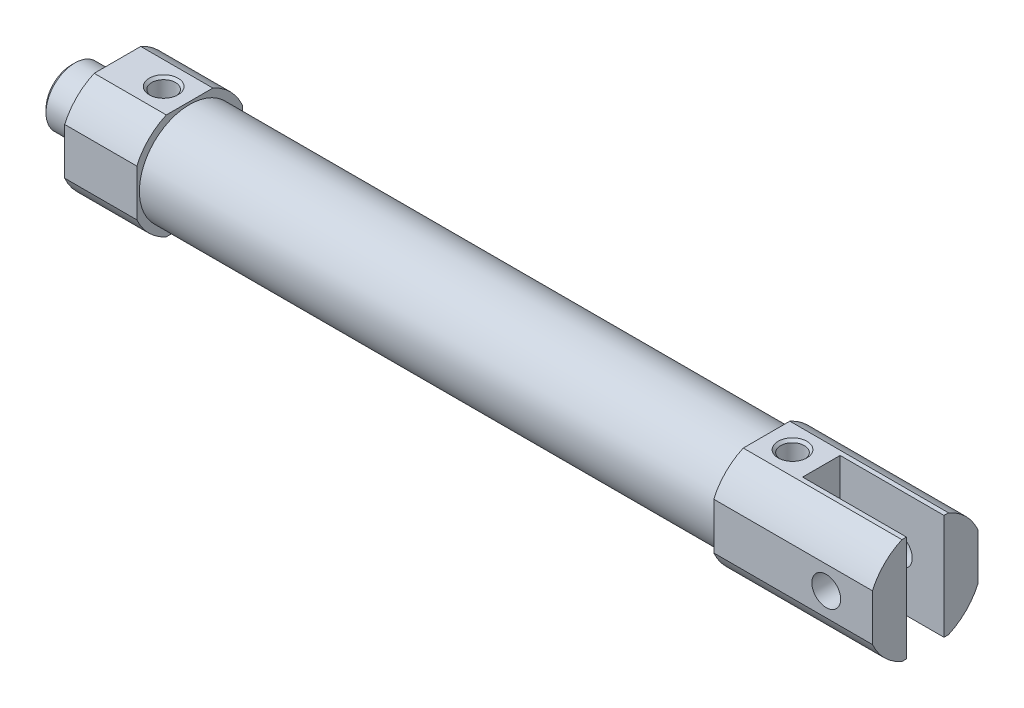
ISO-10303-21;
HEADER;
FILE_DESCRIPTION(('STEP AP214'),'2;1');
FILE_NAME('part.step','',(''),(''),'','','');
FILE_SCHEMA(('AUTOMOTIVE_DESIGN { 1 0 10303 214 1 1 1 1 }'));
ENDSEC;
DATA;
#1=APPLICATION_CONTEXT('core data for automotive mechanical design processes');
#2=APPLICATION_PROTOCOL_DEFINITION('international standard','automotive_design',2000,#1);
#3=PRODUCT_CONTEXT('',#1,'mechanical');
#4=PRODUCT('Part','Part','',(#3));
#5=PRODUCT_RELATED_PRODUCT_CATEGORY('part','',(#4));
#6=PRODUCT_DEFINITION_FORMATION('','',#4);
#7=PRODUCT_DEFINITION_CONTEXT('part definition',#1,'design');
#8=PRODUCT_DEFINITION('design','',#6,#7);
#9=PRODUCT_DEFINITION_SHAPE('','',#8);
#10=(LENGTH_UNIT() NAMED_UNIT(*) SI_UNIT(.MILLI.,.METRE.));
#11=(NAMED_UNIT(*) PLANE_ANGLE_UNIT() SI_UNIT($,.RADIAN.));
#12=(NAMED_UNIT(*) SI_UNIT($,.STERADIAN.) SOLID_ANGLE_UNIT());
#13=UNCERTAINTY_MEASURE_WITH_UNIT(LENGTH_MEASURE(1.E-05),#10,'distance_accuracy_value','');
#14=(GEOMETRIC_REPRESENTATION_CONTEXT(3) GLOBAL_UNCERTAINTY_ASSIGNED_CONTEXT((#13)) GLOBAL_UNIT_ASSIGNED_CONTEXT((#10,
#11,#12)) REPRESENTATION_CONTEXT('',''));
#15=CARTESIAN_POINT('',(0.,0.,0.));
#16=DIRECTION('',(0.,0.,1.));
#17=DIRECTION('',(1.,0.,0.));
#18=AXIS2_PLACEMENT_3D('',#15,#16,#17);
#19=CARTESIAN_POINT('',(112.5,-9.15,-4.0345383874738));
#20=DIRECTION('',(0.,-1.,0.));
#21=DIRECTION('',(1.,0.,0.));
#22=AXIS2_PLACEMENT_3D('',#19,#20,#21);
#23=PLANE('',#22);
#24=DIRECTION('',(1.,0.,0.));
#25=VECTOR('',#24,1.);
#26=CARTESIAN_POINT('',(122.,-9.15,3.25));
#27=LINE('',#26,#25);
#28=CARTESIAN_POINT('',(122.,-9.15,3.25));
#29=VERTEX_POINT('',#28);
#30=CARTESIAN_POINT('',(140.,-9.15,3.25));
#31=VERTEX_POINT('',#30);
#32=EDGE_CURVE('E157',#29,#31,#27,.T.);
#33=ORIENTED_EDGE('',*,*,#32,.T.);
#34=DIRECTION('',(0.,0.,1.));
#35=VECTOR('',#34,1.);
#36=CARTESIAN_POINT('',(140.,-9.15,3.25));
#37=LINE('',#36,#35);
#38=CARTESIAN_POINT('',(140.,-9.15,4.03453838747381));
#39=VERTEX_POINT('',#38);
#40=EDGE_CURVE('E172',#39,#31,#37,.F.);
#41=ORIENTED_EDGE('',*,*,#40,.F.);
#42=DIRECTION('',(-1.,0.,0.));
#43=VECTOR('',#42,1.);
#44=CARTESIAN_POINT('',(140.,-9.15,4.03453838747381));
#45=LINE('',#44,#43);
#46=CARTESIAN_POINT('',(112.5,-9.15,4.03453838747381));
#47=VERTEX_POINT('',#46);
#48=EDGE_CURVE('E181',#39,#47,#45,.T.);
#49=ORIENTED_EDGE('',*,*,#48,.T.);
#50=DIRECTION('',(0.,0.,-1.));
#51=VECTOR('',#50,1.);
#52=CARTESIAN_POINT('',(112.5,-9.15,4.03453838747381));
#53=LINE('',#52,#51);
#54=CARTESIAN_POINT('',(112.5,-9.15,-4.0345383874738));
#55=VERTEX_POINT('',#54);
#56=EDGE_CURVE('E183',#47,#55,#53,.T.);
#57=ORIENTED_EDGE('',*,*,#56,.T.);
#58=DIRECTION('',(1.,0.,0.));
#59=VECTOR('',#58,1.);
#60=CARTESIAN_POINT('',(112.5,-9.15,-4.0345383874738));
#61=LINE('',#60,#59);
#62=CARTESIAN_POINT('',(140.,-9.15,-4.0345383874738));
#63=VERTEX_POINT('',#62);
#64=EDGE_CURVE('E194',#63,#55,#61,.F.);
#65=ORIENTED_EDGE('',*,*,#64,.F.);
#66=DIRECTION('',(0.,0.,1.));
#67=VECTOR('',#66,1.);
#68=CARTESIAN_POINT('',(140.,-9.15,-4.0345383874738));
#69=LINE('',#68,#67);
#70=CARTESIAN_POINT('',(140.,-9.15,-3.25));
#71=VERTEX_POINT('',#70);
#72=EDGE_CURVE('E199',#71,#63,#69,.F.);
#73=ORIENTED_EDGE('',*,*,#72,.F.);
#74=DIRECTION('',(-1.,0.,0.));
#75=VECTOR('',#74,1.);
#76=CARTESIAN_POINT('',(140.,-9.15,-3.25));
#77=LINE('',#76,#75);
#78=CARTESIAN_POINT('',(122.,-9.15,-3.25));
#79=VERTEX_POINT('',#78);
#80=EDGE_CURVE('E204',#71,#79,#77,.T.);
#81=ORIENTED_EDGE('',*,*,#80,.T.);
#82=DIRECTION('',(0.,0.,1.));
#83=VECTOR('',#82,1.);
#84=CARTESIAN_POINT('',(122.,-9.15,-3.25));
#85=LINE('',#84,#83);
#86=EDGE_CURVE('E175',#79,#29,#85,.T.);
#87=ORIENTED_EDGE('',*,*,#86,.T.);
#88=EDGE_LOOP('',(#33,#41,#49,#57,#65,#73,#81,#87));
#89=FACE_BOUND('',#88,.T.);
#90=ADVANCED_FACE('F17',(#89),#23,.T.);
#91=CARTESIAN_POINT('',(112.5,9.15,4.0345383874738));
#92=DIRECTION('',(0.,1.,0.));
#93=DIRECTION('',(1.,0.,0.));
#94=AXIS2_PLACEMENT_3D('',#91,#92,#93);
#95=PLANE('',#94);
#96=DIRECTION('',(-1.,0.,0.));
#97=VECTOR('',#96,1.);
#98=CARTESIAN_POINT('',(140.,9.15,3.25));
#99=LINE('',#98,#97);
#100=CARTESIAN_POINT('',(122.,9.15,3.25));
#101=VERTEX_POINT('',#100);
#102=CARTESIAN_POINT('',(140.,9.15,3.25));
#103=VERTEX_POINT('',#102);
#104=EDGE_CURVE('E160',#101,#103,#99,.F.);
#105=ORIENTED_EDGE('',*,*,#104,.F.);
#106=DIRECTION('',(0.,0.,-1.));
#107=VECTOR('',#106,1.);
#108=CARTESIAN_POINT('',(122.,9.15,3.25));
#109=LINE('',#108,#107);
#110=CARTESIAN_POINT('',(122.,9.15,-3.25));
#111=VERTEX_POINT('',#110);
#112=EDGE_CURVE('E214',#111,#101,#109,.F.);
#113=ORIENTED_EDGE('',*,*,#112,.F.);
#114=DIRECTION('',(1.,0.,0.));
#115=VECTOR('',#114,1.);
#116=CARTESIAN_POINT('',(122.,9.15,-3.25));
#117=LINE('',#116,#115);
#118=CARTESIAN_POINT('',(140.,9.15,-3.25));
#119=VERTEX_POINT('',#118);
#120=EDGE_CURVE('E219',#119,#111,#117,.F.);
#121=ORIENTED_EDGE('',*,*,#120,.F.);
#122=DIRECTION('',(0.,0.,-1.));
#123=VECTOR('',#122,1.);
#124=CARTESIAN_POINT('',(140.,9.15,-3.25));
#125=LINE('',#124,#123);
#126=CARTESIAN_POINT('',(140.,9.15,-4.0345383874738));
#127=VERTEX_POINT('',#126);
#128=EDGE_CURVE('E223',#127,#119,#125,.F.);
#129=ORIENTED_EDGE('',*,*,#128,.F.);
#130=DIRECTION('',(-1.,0.,0.));
#131=VECTOR('',#130,1.);
#132=CARTESIAN_POINT('',(140.,9.15,-4.0345383874738));
#133=LINE('',#132,#131);
#134=CARTESIAN_POINT('',(112.5,9.15,-4.0345383874738));
#135=VERTEX_POINT('',#134);
#136=EDGE_CURVE('E228',#127,#135,#133,.T.);
#137=ORIENTED_EDGE('',*,*,#136,.T.);
#138=DIRECTION('',(0.,0.,1.));
#139=VECTOR('',#138,1.);
#140=CARTESIAN_POINT('',(112.5,9.15,-4.0345383874738));
#141=LINE('',#140,#139);
#142=CARTESIAN_POINT('',(112.5,9.15,4.0345383874738));
#143=VERTEX_POINT('',#142);
#144=EDGE_CURVE('E233',#135,#143,#141,.T.);
#145=ORIENTED_EDGE('',*,*,#144,.T.);
#146=DIRECTION('',(1.,0.,0.));
#147=VECTOR('',#146,1.);
#148=CARTESIAN_POINT('',(112.5,9.15,4.0345383874738));
#149=LINE('',#148,#147);
#150=CARTESIAN_POINT('',(140.,9.15,4.0345383874738));
#151=VERTEX_POINT('',#150);
#152=EDGE_CURVE('E238',#151,#143,#149,.F.);
#153=ORIENTED_EDGE('',*,*,#152,.F.);
#154=DIRECTION('',(0.,0.,-1.));
#155=VECTOR('',#154,1.);
#156=CARTESIAN_POINT('',(140.,9.15,4.0345383874738));
#157=LINE('',#156,#155);
#158=EDGE_CURVE('E243',#103,#151,#157,.F.);
#159=ORIENTED_EDGE('',*,*,#158,.F.);
#160=EDGE_LOOP('',(#105,#113,#121,#129,#137,#145,#153,#159));
#161=FACE_BOUND('',#160,.T.);
#162=CARTESIAN_POINT('',(117.,9.15,0.));
#163=DIRECTION('',(0.,-1.,0.));
#164=DIRECTION('',(0.,0.,1.));
#165=AXIS2_PLACEMENT_3D('',#162,#163,#164);
#166=CIRCLE('',#165,2.5);
#167=CARTESIAN_POINT('',(117.,9.15,2.5));
#168=VERTEX_POINT('',#167);
#169=EDGE_CURVE('E166',#168,#168,#166,.F.);
#170=ORIENTED_EDGE('',*,*,#169,.F.);
#171=EDGE_LOOP('',(#170));
#172=FACE_BOUND('',#171,.T.);
#173=ADVANCED_FACE('F522',(#161,#172),#95,.T.);
#174=CARTESIAN_POINT('',(140.,-9.15,9.15000000000001));
#175=DIRECTION('',(1.,0.,0.));
#176=DIRECTION('',(0.,0.,-1.));
#177=AXIS2_PLACEMENT_3D('',#174,#175,#176);
#178=PLANE('',#177);
#179=ORIENTED_EDGE('',*,*,#40,.T.);
#180=DIRECTION('',(0.,1.,0.));
#181=VECTOR('',#180,1.);
#182=CARTESIAN_POINT('',(140.,-9.15,3.25));
#183=LINE('',#182,#181);
#184=EDGE_CURVE('E153',#103,#31,#183,.F.);
#185=ORIENTED_EDGE('',*,*,#184,.F.);
#186=ORIENTED_EDGE('',*,*,#158,.T.);
#187=CARTESIAN_POINT('',(140.,5.30825383648903E-13,5.31692745386891E-13));
#188=DIRECTION('',(1.,0.,0.));
#189=DIRECTION('',(0.,0.915000000000012,0.403453838747356));
#190=AXIS2_PLACEMENT_3D('',#187,#188,#189);
#191=CIRCLE('',#190,9.99999999999929);
#192=CARTESIAN_POINT('',(140.,4.0345383874738,9.15000000000001));
#193=VERTEX_POINT('',#192);
#194=EDGE_CURVE('E165',#151,#193,#191,.T.);
#195=ORIENTED_EDGE('',*,*,#194,.T.);
#196=DIRECTION('',(0.,-1.,0.));
#197=VECTOR('',#196,1.);
#198=CARTESIAN_POINT('',(140.,4.0345383874738,9.15));
#199=LINE('',#198,#197);
#200=CARTESIAN_POINT('',(140.,-4.0345383874738,9.15000000000001));
#201=VERTEX_POINT('',#200);
#202=EDGE_CURVE('E255',#193,#201,#199,.T.);
#203=ORIENTED_EDGE('',*,*,#202,.T.);
#204=CARTESIAN_POINT('',(140.,-5.31692745386891E-13,5.30825383648903E-13));
#205=DIRECTION('',(1.,0.,0.));
#206=DIRECTION('',(0.,-0.403453838747355,0.915000000000013));
#207=AXIS2_PLACEMENT_3D('',#204,#205,#206);
#208=CIRCLE('',#207,9.99999999999929);
#209=EDGE_CURVE('E180',#201,#39,#208,.T.);
#210=ORIENTED_EDGE('',*,*,#209,.T.);
#211=EDGE_LOOP('',(#179,#185,#186,#195,#203,#210));
#212=FACE_BOUND('',#211,.T.);
#213=ADVANCED_FACE('F178',(#212),#178,.T.);
#214=CARTESIAN_POINT('',(140.,-9.15000000000001,-3.25));
#215=DIRECTION('',(1.,0.,0.));
#216=DIRECTION('',(0.,0.,-1.));
#217=AXIS2_PLACEMENT_3D('',#214,#215,#216);
#218=PLANE('',#217);
#219=ORIENTED_EDGE('',*,*,#128,.T.);
#220=DIRECTION('',(0.,-1.,0.));
#221=VECTOR('',#220,1.);
#222=CARTESIAN_POINT('',(140.,9.15,-3.25));
#223=LINE('',#222,#221);
#224=EDGE_CURVE('E262',#119,#71,#223,.T.);
#225=ORIENTED_EDGE('',*,*,#224,.T.);
#226=ORIENTED_EDGE('',*,*,#72,.T.);
#227=CARTESIAN_POINT('',(140.,-5.30825383648903E-13,-5.31692745386891E-13));
#228=DIRECTION('',(1.,0.,0.));
#229=DIRECTION('',(0.,-0.915000000000013,-0.403453838747355));
#230=AXIS2_PLACEMENT_3D('',#227,#228,#229);
#231=CIRCLE('',#230,9.99999999999929);
#232=CARTESIAN_POINT('',(140.,-4.03453838747381,-9.15));
#233=VERTEX_POINT('',#232);
#234=EDGE_CURVE('E267',#63,#233,#231,.T.);
#235=ORIENTED_EDGE('',*,*,#234,.T.);
#236=DIRECTION('',(0.,1.,0.));
#237=VECTOR('',#236,1.);
#238=CARTESIAN_POINT('',(140.,-4.03453838747381,-9.15));
#239=LINE('',#238,#237);
#240=CARTESIAN_POINT('',(140.,4.0345383874738,-9.15000000000001));
#241=VERTEX_POINT('',#240);
#242=EDGE_CURVE('E272',#233,#241,#239,.T.);
#243=ORIENTED_EDGE('',*,*,#242,.T.);
#244=CARTESIAN_POINT('',(140.,5.31692745386891E-13,-5.30825383648903E-13));
#245=DIRECTION('',(1.,0.,0.));
#246=DIRECTION('',(0.,0.403453838747355,-0.915000000000012));
#247=AXIS2_PLACEMENT_3D('',#244,#245,#246);
#248=CIRCLE('',#247,9.99999999999929);
#249=EDGE_CURVE('E277',#241,#127,#248,.T.);
#250=ORIENTED_EDGE('',*,*,#249,.T.);
#251=EDGE_LOOP('',(#219,#225,#226,#235,#243,#250));
#252=FACE_BOUND('',#251,.T.);
#253=ADVANCED_FACE('F532',(#252),#218,.T.);
#254=CARTESIAN_POINT('',(-8.,-4.3865,4.3865));
#255=DIRECTION('',(-1.,0.,0.));
#256=DIRECTION('',(0.,1.,0.));
#257=AXIS2_PLACEMENT_3D('',#254,#255,#256);
#258=PLANE('',#257);
#259=CARTESIAN_POINT('',(-8.,0.,0.));
#260=DIRECTION('',(-1.,0.,0.));
#261=DIRECTION('',(0.,0.,-1.));
#262=AXIS2_PLACEMENT_3D('',#259,#260,#261);
#263=CIRCLE('',#262,4.3865);
#264=CARTESIAN_POINT('',(-8.,0.,-4.3865));
#265=VERTEX_POINT('',#264);
#266=EDGE_CURVE('E282',#265,#265,#263,.F.);
#267=ORIENTED_EDGE('',*,*,#266,.F.);
#268=EDGE_LOOP('',(#267));
#269=FACE_BOUND('',#268,.T.);
#270=CARTESIAN_POINT('',(-8.,0.,0.));
#271=DIRECTION('',(1.,0.,0.));
#272=DIRECTION('',(0.,-1.420539007313E-07,0.99999999999999));
#273=AXIS2_PLACEMENT_3D('',#270,#271,#272);
#274=CIRCLE('',#273,2.5);
#275=CARTESIAN_POINT('',(-8.,-3.55134751828251E-07,2.49999999999997));
#276=VERTEX_POINT('',#275);
#277=EDGE_CURVE('E287',#276,#276,#274,.T.);
#278=ORIENTED_EDGE('',*,*,#277,.T.);
#279=EDGE_LOOP('',(#278));
#280=FACE_BOUND('',#279,.T.);
#281=ADVANCED_FACE('F535',(#269,#280),#258,.T.);
#282=CARTESIAN_POINT('',(12.5,5.30825383648903E-13,5.31692745386891E-13));
#283=DIRECTION('',(-1.,0.,0.));
#284=DIRECTION('',(0.,0.403453838747356,0.915000000000012));
#285=AXIS2_PLACEMENT_3D('',#282,#283,#284);
#286=CYLINDRICAL_SURFACE('',#285,9.99999999999929);
#287=CARTESIAN_POINT('',(0.,5.30825383648903E-13,5.31692745386891E-13));
#288=DIRECTION('',(1.,0.,0.));
#289=DIRECTION('',(0.,0.915000000000012,0.403453838747356));
#290=AXIS2_PLACEMENT_3D('',#287,#288,#289);
#291=CIRCLE('',#290,9.99999999999929);
#292=CARTESIAN_POINT('',(0.,9.15000000000001,4.0345383874738));
#293=VERTEX_POINT('',#292);
#294=CARTESIAN_POINT('',(0.,4.03453838747381,9.15000000000001));
#295=VERTEX_POINT('',#294);
#296=EDGE_CURVE('E290',#293,#295,#291,.T.);
#297=ORIENTED_EDGE('',*,*,#296,.T.);
#298=DIRECTION('',(1.,0.,0.));
#299=VECTOR('',#298,1.);
#300=CARTESIAN_POINT('',(0.,4.03453838747381,9.15000000000001));
#301=LINE('',#300,#299);
#302=CARTESIAN_POINT('',(12.5,4.03453838747381,9.15000000000001));
#303=VERTEX_POINT('',#302);
#304=EDGE_CURVE('E293',#303,#295,#301,.F.);
#305=ORIENTED_EDGE('',*,*,#304,.F.);
#306=CARTESIAN_POINT('',(12.5,5.30825383648903E-13,5.31692745386891E-13));
#307=DIRECTION('',(-1.,0.,0.));
#308=DIRECTION('',(0.,0.403453838747356,0.915000000000012));
#309=AXIS2_PLACEMENT_3D('',#306,#307,#308);
#310=CIRCLE('',#309,9.99999999999929);
#311=CARTESIAN_POINT('',(12.5,9.15000000000001,4.0345383874738));
#312=VERTEX_POINT('',#311);
#313=EDGE_CURVE('E298',#312,#303,#310,.F.);
#314=ORIENTED_EDGE('',*,*,#313,.F.);
#315=DIRECTION('',(-1.,0.,0.));
#316=VECTOR('',#315,1.);
#317=CARTESIAN_POINT('',(12.5,9.15000000000001,4.0345383874738));
#318=LINE('',#317,#316);
#319=EDGE_CURVE('E302',#312,#293,#318,.T.);
#320=ORIENTED_EDGE('',*,*,#319,.T.);
#321=EDGE_LOOP('',(#297,#305,#314,#320));
#322=FACE_BOUND('',#321,.T.);
#323=ADVANCED_FACE('F539',(#322),#286,.T.);
#324=CARTESIAN_POINT('',(12.5,-4.0345383874738,9.15));
#325=DIRECTION('',(0.,0.,1.));
#326=DIRECTION('',(0.,1.,0.));
#327=AXIS2_PLACEMENT_3D('',#324,#325,#326);
#328=PLANE('',#327);
#329=DIRECTION('',(0.,-1.,0.));
#330=VECTOR('',#329,1.);
#331=CARTESIAN_POINT('',(0.,4.0345383874738,9.15));
#332=LINE('',#331,#330);
#333=CARTESIAN_POINT('',(0.,-4.0345383874738,9.15));
#334=VERTEX_POINT('',#333);
#335=EDGE_CURVE('E307',#295,#334,#332,.T.);
#336=ORIENTED_EDGE('',*,*,#335,.T.);
#337=DIRECTION('',(1.,0.,0.));
#338=VECTOR('',#337,1.);
#339=CARTESIAN_POINT('',(0.,-4.0345383874738,9.15));
#340=LINE('',#339,#338);
#341=CARTESIAN_POINT('',(12.5,-4.0345383874738,9.15));
#342=VERTEX_POINT('',#341);
#343=EDGE_CURVE('E312',#342,#334,#340,.F.);
#344=ORIENTED_EDGE('',*,*,#343,.F.);
#345=DIRECTION('',(0.,1.,0.));
#346=VECTOR('',#345,1.);
#347=CARTESIAN_POINT('',(12.5,-4.0345383874738,9.15));
#348=LINE('',#347,#346);
#349=EDGE_CURVE('E317',#303,#342,#348,.F.);
#350=ORIENTED_EDGE('',*,*,#349,.F.);
#351=ORIENTED_EDGE('',*,*,#304,.T.);
#352=EDGE_LOOP('',(#336,#344,#350,#351));
#353=FACE_BOUND('',#352,.T.);
#354=ADVANCED_FACE('F543',(#353),#328,.T.);
#355=CARTESIAN_POINT('',(12.5,-5.31692745386891E-13,5.30825383648903E-13));
#356=DIRECTION('',(-1.,0.,0.));
#357=DIRECTION('',(0.,-0.915000000000013,0.403453838747355));
#358=AXIS2_PLACEMENT_3D('',#355,#356,#357);
#359=CYLINDRICAL_SURFACE('',#358,9.99999999999929);
#360=CARTESIAN_POINT('',(0.,-5.31692745386891E-13,5.30825383648903E-13));
#361=DIRECTION('',(1.,0.,0.));
#362=DIRECTION('',(0.,-0.403453838747356,0.915000000000012));
#363=AXIS2_PLACEMENT_3D('',#360,#361,#362);
#364=CIRCLE('',#363,9.99999999999929);
#365=CARTESIAN_POINT('',(0.,-9.15000000000001,4.0345383874738));
#366=VERTEX_POINT('',#365);
#367=EDGE_CURVE('E321',#334,#366,#364,.T.);
#368=ORIENTED_EDGE('',*,*,#367,.T.);
#369=DIRECTION('',(1.,0.,0.));
#370=VECTOR('',#369,1.);
#371=CARTESIAN_POINT('',(0.,-9.15000000000001,4.03453838747381));
#372=LINE('',#371,#370);
#373=CARTESIAN_POINT('',(12.5,-9.15000000000001,4.03453838747381));
#374=VERTEX_POINT('',#373);
#375=EDGE_CURVE('E326',#374,#366,#372,.F.);
#376=ORIENTED_EDGE('',*,*,#375,.F.);
#377=CARTESIAN_POINT('',(12.5,-5.31692745386891E-13,5.30825383648903E-13));
#378=DIRECTION('',(-1.,0.,0.));
#379=DIRECTION('',(0.,-0.915000000000012,0.403453838747357));
#380=AXIS2_PLACEMENT_3D('',#377,#378,#379);
#381=CIRCLE('',#380,9.99999999999929);
#382=EDGE_CURVE('E331',#342,#374,#381,.F.);
#383=ORIENTED_EDGE('',*,*,#382,.F.);
#384=ORIENTED_EDGE('',*,*,#343,.T.);
#385=EDGE_LOOP('',(#368,#376,#383,#384));
#386=FACE_BOUND('',#385,.T.);
#387=ADVANCED_FACE('F547',(#386),#359,.T.);
#388=CARTESIAN_POINT('',(0.,-9.15,-4.0345383874738));
#389=DIRECTION('',(0.,-1.,0.));
#390=DIRECTION('',(1.,0.,0.));
#391=AXIS2_PLACEMENT_3D('',#388,#389,#390);
#392=PLANE('',#391);
#393=DIRECTION('',(0.,0.,-1.));
#394=VECTOR('',#393,1.);
#395=CARTESIAN_POINT('',(0.,-9.15,4.03453838747381));
#396=LINE('',#395,#394);
#397=CARTESIAN_POINT('',(0.,-9.15,-4.0345383874738));
#398=VERTEX_POINT('',#397);
#399=EDGE_CURVE('E335',#366,#398,#396,.T.);
#400=ORIENTED_EDGE('',*,*,#399,.T.);
#401=DIRECTION('',(1.,0.,0.));
#402=VECTOR('',#401,1.);
#403=CARTESIAN_POINT('',(0.,-9.15,-4.0345383874738));
#404=LINE('',#403,#402);
#405=CARTESIAN_POINT('',(12.5,-9.15,-4.0345383874738));
#406=VERTEX_POINT('',#405);
#407=EDGE_CURVE('E340',#406,#398,#404,.F.);
#408=ORIENTED_EDGE('',*,*,#407,.F.);
#409=DIRECTION('',(0.,0.,1.));
#410=VECTOR('',#409,1.);
#411=CARTESIAN_POINT('',(12.5,-9.15,-4.0345383874738));
#412=LINE('',#411,#410);
#413=EDGE_CURVE('E345',#374,#406,#412,.F.);
#414=ORIENTED_EDGE('',*,*,#413,.F.);
#415=ORIENTED_EDGE('',*,*,#375,.T.);
#416=EDGE_LOOP('',(#400,#408,#414,#415));
#417=FACE_BOUND('',#416,.T.);
#418=ADVANCED_FACE('F551',(#417),#392,.T.);
#419=CARTESIAN_POINT('',(12.5,-5.30825383648903E-13,-5.31692745386891E-13));
#420=DIRECTION('',(-1.,0.,0.));
#421=DIRECTION('',(0.,-0.403453838747356,-0.915000000000012));
#422=AXIS2_PLACEMENT_3D('',#419,#420,#421);
#423=CYLINDRICAL_SURFACE('',#422,9.99999999999929);
#424=CARTESIAN_POINT('',(0.,-5.30825383648903E-13,-5.31692745386891E-13));
#425=DIRECTION('',(1.,0.,0.));
#426=DIRECTION('',(0.,-0.915000000000012,-0.403453838747356));
#427=AXIS2_PLACEMENT_3D('',#424,#425,#426);
#428=CIRCLE('',#427,9.99999999999929);
#429=CARTESIAN_POINT('',(0.,-4.03453838747381,-9.15000000000001));
#430=VERTEX_POINT('',#429);
#431=EDGE_CURVE('E349',#398,#430,#428,.T.);
#432=ORIENTED_EDGE('',*,*,#431,.T.);
#433=DIRECTION('',(1.,0.,0.));
#434=VECTOR('',#433,1.);
#435=CARTESIAN_POINT('',(0.,-4.03453838747381,-9.15));
#436=LINE('',#435,#434);
#437=CARTESIAN_POINT('',(12.5,-4.03453838747381,-9.15));
#438=VERTEX_POINT('',#437);
#439=EDGE_CURVE('E354',#438,#430,#436,.F.);
#440=ORIENTED_EDGE('',*,*,#439,.F.);
#441=CARTESIAN_POINT('',(12.5,-5.30825383648903E-13,-5.31692745386891E-13));
#442=DIRECTION('',(-1.,0.,0.));
#443=DIRECTION('',(0.,-0.403453838747356,-0.915000000000012));
#444=AXIS2_PLACEMENT_3D('',#441,#442,#443);
#445=CIRCLE('',#444,9.99999999999929);
#446=EDGE_CURVE('E359',#406,#438,#445,.F.);
#447=ORIENTED_EDGE('',*,*,#446,.F.);
#448=ORIENTED_EDGE('',*,*,#407,.T.);
#449=EDGE_LOOP('',(#432,#440,#447,#448));
#450=FACE_BOUND('',#449,.T.);
#451=ADVANCED_FACE('F555',(#450),#423,.T.);
#452=CARTESIAN_POINT('',(0.,-4.03453838747381,-9.15));
#453=DIRECTION('',(0.,0.,-1.));
#454=DIRECTION('',(0.,1.,0.));
#455=AXIS2_PLACEMENT_3D('',#452,#453,#454);
#456=PLANE('',#455);
#457=DIRECTION('',(0.,1.,0.));
#458=VECTOR('',#457,1.);
#459=CARTESIAN_POINT('',(0.,-4.03453838747381,-9.15));
#460=LINE('',#459,#458);
#461=CARTESIAN_POINT('',(0.,4.0345383874738,-9.15));
#462=VERTEX_POINT('',#461);
#463=EDGE_CURVE('E363',#430,#462,#460,.T.);
#464=ORIENTED_EDGE('',*,*,#463,.T.);
#465=DIRECTION('',(1.,0.,0.));
#466=VECTOR('',#465,1.);
#467=CARTESIAN_POINT('',(0.,4.0345383874738,-9.15));
#468=LINE('',#467,#466);
#469=CARTESIAN_POINT('',(12.5,4.0345383874738,-9.15));
#470=VERTEX_POINT('',#469);
#471=EDGE_CURVE('E368',#470,#462,#468,.F.);
#472=ORIENTED_EDGE('',*,*,#471,.F.);
#473=DIRECTION('',(0.,-1.,0.));
#474=VECTOR('',#473,1.);
#475=CARTESIAN_POINT('',(12.5,4.0345383874738,-9.15));
#476=LINE('',#475,#474);
#477=EDGE_CURVE('E373',#438,#470,#476,.F.);
#478=ORIENTED_EDGE('',*,*,#477,.F.);
#479=ORIENTED_EDGE('',*,*,#439,.T.);
#480=EDGE_LOOP('',(#464,#472,#478,#479));
#481=FACE_BOUND('',#480,.T.);
#482=ADVANCED_FACE('F559',(#481),#456,.T.);
#483=CARTESIAN_POINT('',(12.5,5.31692745386891E-13,-5.30825383648903E-13));
#484=DIRECTION('',(-1.,0.,0.));
#485=DIRECTION('',(0.,0.915000000000012,-0.403453838747356));
#486=AXIS2_PLACEMENT_3D('',#483,#484,#485);
#487=CYLINDRICAL_SURFACE('',#486,9.99999999999929);
#488=CARTESIAN_POINT('',(0.,5.31692745386891E-13,-5.30825383648903E-13));
#489=DIRECTION('',(1.,0.,0.));
#490=DIRECTION('',(0.,0.403453838747356,-0.915000000000012));
#491=AXIS2_PLACEMENT_3D('',#488,#489,#490);
#492=CIRCLE('',#491,9.99999999999929);
#493=CARTESIAN_POINT('',(0.,9.15000000000001,-4.03453838747381));
#494=VERTEX_POINT('',#493);
#495=EDGE_CURVE('E377',#462,#494,#492,.T.);
#496=ORIENTED_EDGE('',*,*,#495,.T.);
#497=DIRECTION('',(1.,0.,0.));
#498=VECTOR('',#497,1.);
#499=CARTESIAN_POINT('',(0.,9.15,-4.03453838747381));
#500=LINE('',#499,#498);
#501=CARTESIAN_POINT('',(12.5,9.15,-4.03453838747381));
#502=VERTEX_POINT('',#501);
#503=EDGE_CURVE('E382',#502,#494,#500,.F.);
#504=ORIENTED_EDGE('',*,*,#503,.F.);
#505=CARTESIAN_POINT('',(12.5,5.31692745386891E-13,-5.30825383648903E-13));
#506=DIRECTION('',(-1.,0.,0.));
#507=DIRECTION('',(0.,0.915000000000012,-0.403453838747356));
#508=AXIS2_PLACEMENT_3D('',#505,#506,#507);
#509=CIRCLE('',#508,9.99999999999929);
#510=EDGE_CURVE('E387',#470,#502,#509,.F.);
#511=ORIENTED_EDGE('',*,*,#510,.F.);
#512=ORIENTED_EDGE('',*,*,#471,.T.);
#513=EDGE_LOOP('',(#496,#504,#511,#512));
#514=FACE_BOUND('',#513,.T.);
#515=ADVANCED_FACE('F563',(#514),#487,.T.);
#516=CARTESIAN_POINT('',(0.,9.15,4.0345383874738));
#517=DIRECTION('',(0.,1.,0.));
#518=DIRECTION('',(1.,0.,0.));
#519=AXIS2_PLACEMENT_3D('',#516,#517,#518);
#520=PLANE('',#519);
#521=DIRECTION('',(0.,0.,1.));
#522=VECTOR('',#521,1.);
#523=CARTESIAN_POINT('',(0.,9.15,-4.0345383874738));
#524=LINE('',#523,#522);
#525=EDGE_CURVE('E391',#494,#293,#524,.T.);
#526=ORIENTED_EDGE('',*,*,#525,.T.);
#527=ORIENTED_EDGE('',*,*,#319,.F.);
#528=DIRECTION('',(0.,0.,-1.));
#529=VECTOR('',#528,1.);
#530=CARTESIAN_POINT('',(12.5,9.15,4.0345383874738));
#531=LINE('',#530,#529);
#532=EDGE_CURVE('E396',#502,#312,#531,.F.);
#533=ORIENTED_EDGE('',*,*,#532,.F.);
#534=ORIENTED_EDGE('',*,*,#503,.T.);
#535=EDGE_LOOP('',(#526,#527,#533,#534));
#536=FACE_BOUND('',#535,.T.);
#537=CARTESIAN_POINT('',(8.,9.15,0.));
#538=DIRECTION('',(0.,-1.,0.));
#539=DIRECTION('',(0.,0.,1.));
#540=AXIS2_PLACEMENT_3D('',#537,#538,#539);
#541=CIRCLE('',#540,2.5);
#542=CARTESIAN_POINT('',(8.,9.15,2.5));
#543=VERTEX_POINT('',#542);
#544=EDGE_CURVE('E400',#543,#543,#541,.F.);
#545=ORIENTED_EDGE('',*,*,#544,.F.);
#546=EDGE_LOOP('',(#545));
#547=FACE_BOUND('',#546,.T.);
#548=ADVANCED_FACE('F567',(#536,#547),#520,.T.);
#549=CARTESIAN_POINT('',(12.5,-9.15000000000001,9.15000000000001));
#550=DIRECTION('',(1.,0.,0.));
#551=DIRECTION('',(0.,0.,-1.));
#552=AXIS2_PLACEMENT_3D('',#549,#550,#551);
#553=PLANE('',#552);
#554=ORIENTED_EDGE('',*,*,#313,.T.);
#555=ORIENTED_EDGE('',*,*,#349,.T.);
#556=ORIENTED_EDGE('',*,*,#382,.T.);
#557=ORIENTED_EDGE('',*,*,#413,.T.);
#558=ORIENTED_EDGE('',*,*,#446,.T.);
#559=ORIENTED_EDGE('',*,*,#477,.T.);
#560=ORIENTED_EDGE('',*,*,#510,.T.);
#561=ORIENTED_EDGE('',*,*,#532,.T.);
#562=EDGE_LOOP('',(#554,#555,#556,#557,#558,#559,#560,#561));
#563=FACE_BOUND('',#562,.T.);
#564=CARTESIAN_POINT('',(12.5,0.,0.));
#565=DIRECTION('',(-1.,0.,0.));
#566=DIRECTION('',(0.,-1.16844485555755E-09,-1.));
#567=AXIS2_PLACEMENT_3D('',#564,#565,#566);
#568=CIRCLE('',#567,8.7);
#569=CARTESIAN_POINT('',(12.5,-1.01654702433507E-08,-8.7));
#570=VERTEX_POINT('',#569);
#571=EDGE_CURVE('E405',#570,#570,#568,.F.);
#572=ORIENTED_EDGE('',*,*,#571,.F.);
#573=EDGE_LOOP('',(#572));
#574=FACE_BOUND('',#573,.T.);
#575=ADVANCED_FACE('F571',(#563,#574),#553,.T.);
#576=CARTESIAN_POINT('',(0.,-9.15000000000001,9.15000000000001));
#577=DIRECTION('',(-1.,0.,0.));
#578=DIRECTION('',(0.,1.,0.));
#579=AXIS2_PLACEMENT_3D('',#576,#577,#578);
#580=PLANE('',#579);
#581=ORIENTED_EDGE('',*,*,#296,.F.);
#582=ORIENTED_EDGE('',*,*,#525,.F.);
#583=ORIENTED_EDGE('',*,*,#495,.F.);
#584=ORIENTED_EDGE('',*,*,#463,.F.);
#585=ORIENTED_EDGE('',*,*,#431,.F.);
#586=ORIENTED_EDGE('',*,*,#399,.F.);
#587=ORIENTED_EDGE('',*,*,#367,.F.);
#588=ORIENTED_EDGE('',*,*,#335,.F.);
#589=EDGE_LOOP('',(#581,#582,#583,#584,#585,#586,#587,#588));
#590=FACE_BOUND('',#589,.T.);
#591=CARTESIAN_POINT('',(0.,0.,0.));
#592=DIRECTION('',(1.,0.,0.));
#593=DIRECTION('',(0.,0.,1.));
#594=AXIS2_PLACEMENT_3D('',#591,#592,#593);
#595=CIRCLE('',#594,5.);
#596=CARTESIAN_POINT('',(0.,0.,5.));
#597=VERTEX_POINT('',#596);
#598=EDGE_CURVE('E408',#597,#597,#595,.T.);
#599=ORIENTED_EDGE('',*,*,#598,.T.);
#600=EDGE_LOOP('',(#599));
#601=FACE_BOUND('',#600,.T.);
#602=ADVANCED_FACE('F575',(#590,#601),#580,.T.);
#603=CARTESIAN_POINT('',(140.,5.30825383648903E-13,5.31692745386891E-13));
#604=DIRECTION('',(-1.,0.,0.));
#605=DIRECTION('',(0.,0.403453838747356,0.915000000000012));
#606=AXIS2_PLACEMENT_3D('',#603,#604,#605);
#607=CYLINDRICAL_SURFACE('',#606,9.99999999999929);
#608=CARTESIAN_POINT('',(112.5,5.30825383648903E-13,5.31692745386891E-13));
#609=DIRECTION('',(1.,0.,0.));
#610=DIRECTION('',(0.,0.915000000000012,0.403453838747356));
#611=AXIS2_PLACEMENT_3D('',#608,#609,#610);
#612=CIRCLE('',#611,9.99999999999929);
#613=CARTESIAN_POINT('',(112.5,4.03453838747381,9.15000000000001));
#614=VERTEX_POINT('',#613);
#615=EDGE_CURVE('E411',#143,#614,#612,.T.);
#616=ORIENTED_EDGE('',*,*,#615,.T.);
#617=DIRECTION('',(1.,0.,0.));
#618=VECTOR('',#617,1.);
#619=CARTESIAN_POINT('',(112.5,4.03453838747381,9.15000000000001));
#620=LINE('',#619,#618);
#621=EDGE_CURVE('E414',#193,#614,#620,.F.);
#622=ORIENTED_EDGE('',*,*,#621,.F.);
#623=ORIENTED_EDGE('',*,*,#194,.F.);
#624=ORIENTED_EDGE('',*,*,#152,.T.);
#625=EDGE_LOOP('',(#616,#622,#623,#624));
#626=FACE_BOUND('',#625,.T.);
#627=ADVANCED_FACE('F579',(#626),#607,.T.);
#628=CARTESIAN_POINT('',(140.,-4.0345383874738,9.15));
#629=DIRECTION('',(0.,0.,1.));
#630=DIRECTION('',(0.,1.,0.));
#631=AXIS2_PLACEMENT_3D('',#628,#629,#630);
#632=PLANE('',#631);
#633=DIRECTION('',(0.,-1.,0.));
#634=VECTOR('',#633,1.);
#635=CARTESIAN_POINT('',(112.5,4.0345383874738,9.15));
#636=LINE('',#635,#634);
#637=CARTESIAN_POINT('',(112.5,-4.0345383874738,9.15));
#638=VERTEX_POINT('',#637);
#639=EDGE_CURVE('E419',#614,#638,#636,.T.);
#640=ORIENTED_EDGE('',*,*,#639,.T.);
#641=DIRECTION('',(1.,0.,0.));
#642=VECTOR('',#641,1.);
#643=CARTESIAN_POINT('',(112.5,-4.0345383874738,9.15));
#644=LINE('',#643,#642);
#645=EDGE_CURVE('E424',#201,#638,#644,.F.);
#646=ORIENTED_EDGE('',*,*,#645,.F.);
#647=ORIENTED_EDGE('',*,*,#202,.F.);
#648=ORIENTED_EDGE('',*,*,#621,.T.);
#649=EDGE_LOOP('',(#640,#646,#647,#648));
#650=FACE_BOUND('',#649,.T.);
#651=CARTESIAN_POINT('',(132.,0.,9.15));
#652=DIRECTION('',(0.,0.,-1.));
#653=DIRECTION('',(1.,0.,0.));
#654=AXIS2_PLACEMENT_3D('',#651,#652,#653);
#655=CIRCLE('',#654,2.5);
#656=CARTESIAN_POINT('',(134.5,0.,9.15));
#657=VERTEX_POINT('',#656);
#658=EDGE_CURVE('E429',#657,#657,#655,.F.);
#659=ORIENTED_EDGE('',*,*,#658,.F.);
#660=EDGE_LOOP('',(#659));
#661=FACE_BOUND('',#660,.T.);
#662=ADVANCED_FACE('F583',(#650,#661),#632,.T.);
#663=CARTESIAN_POINT('',(140.,-5.31692745386891E-13,5.30825383648903E-13));
#664=DIRECTION('',(-1.,0.,0.));
#665=DIRECTION('',(0.,-0.915000000000013,0.403453838747355));
#666=AXIS2_PLACEMENT_3D('',#663,#664,#665);
#667=CYLINDRICAL_SURFACE('',#666,9.99999999999929);
#668=CARTESIAN_POINT('',(112.5,-5.31692745386891E-13,5.30825383648903E-13));
#669=DIRECTION('',(1.,0.,0.));
#670=DIRECTION('',(0.,-0.403453838747356,0.915000000000012));
#671=AXIS2_PLACEMENT_3D('',#668,#669,#670);
#672=CIRCLE('',#671,9.99999999999929);
#673=EDGE_CURVE('E434',#638,#47,#672,.T.);
#674=ORIENTED_EDGE('',*,*,#673,.T.);
#675=ORIENTED_EDGE('',*,*,#48,.F.);
#676=ORIENTED_EDGE('',*,*,#209,.F.);
#677=ORIENTED_EDGE('',*,*,#645,.T.);
#678=EDGE_LOOP('',(#674,#675,#676,#677));
#679=FACE_BOUND('',#678,.T.);
#680=ADVANCED_FACE('F587',(#679),#667,.T.);
#681=CARTESIAN_POINT('',(140.,-5.30825383648903E-13,-5.31692745386891E-13));
#682=DIRECTION('',(-1.,0.,0.));
#683=DIRECTION('',(0.,-0.403453838747356,-0.915000000000012));
#684=AXIS2_PLACEMENT_3D('',#681,#682,#683);
#685=CYLINDRICAL_SURFACE('',#684,9.99999999999929);
#686=CARTESIAN_POINT('',(112.5,-5.30825383648903E-13,-5.31692745386891E-13));
#687=DIRECTION('',(1.,0.,0.));
#688=DIRECTION('',(0.,-0.915000000000012,-0.403453838747356));
#689=AXIS2_PLACEMENT_3D('',#686,#687,#688);
#690=CIRCLE('',#689,9.99999999999929);
#691=CARTESIAN_POINT('',(112.5,-4.03453838747381,-9.15000000000001));
#692=VERTEX_POINT('',#691);
#693=EDGE_CURVE('E437',#55,#692,#690,.T.);
#694=ORIENTED_EDGE('',*,*,#693,.T.);
#695=DIRECTION('',(1.,0.,0.));
#696=VECTOR('',#695,1.);
#697=CARTESIAN_POINT('',(112.5,-4.03453838747381,-9.15));
#698=LINE('',#697,#696);
#699=EDGE_CURVE('E442',#233,#692,#698,.F.);
#700=ORIENTED_EDGE('',*,*,#699,.F.);
#701=ORIENTED_EDGE('',*,*,#234,.F.);
#702=ORIENTED_EDGE('',*,*,#64,.T.);
#703=EDGE_LOOP('',(#694,#700,#701,#702));
#704=FACE_BOUND('',#703,.T.);
#705=ADVANCED_FACE('F591',(#704),#685,.T.);
#706=CARTESIAN_POINT('',(112.5,-4.03453838747381,-9.15));
#707=DIRECTION('',(0.,0.,-1.));
#708=DIRECTION('',(0.,1.,0.));
#709=AXIS2_PLACEMENT_3D('',#706,#707,#708);
#710=PLANE('',#709);
#711=DIRECTION('',(0.,1.,0.));
#712=VECTOR('',#711,1.);
#713=CARTESIAN_POINT('',(112.5,-4.03453838747381,-9.15));
#714=LINE('',#713,#712);
#715=CARTESIAN_POINT('',(112.5,4.0345383874738,-9.15));
#716=VERTEX_POINT('',#715);
#717=EDGE_CURVE('E447',#692,#716,#714,.T.);
#718=ORIENTED_EDGE('',*,*,#717,.T.);
#719=DIRECTION('',(1.,0.,0.));
#720=VECTOR('',#719,1.);
#721=CARTESIAN_POINT('',(112.5,4.0345383874738,-9.15));
#722=LINE('',#721,#720);
#723=EDGE_CURVE('E452',#241,#716,#722,.F.);
#724=ORIENTED_EDGE('',*,*,#723,.F.);
#725=ORIENTED_EDGE('',*,*,#242,.F.);
#726=ORIENTED_EDGE('',*,*,#699,.T.);
#727=EDGE_LOOP('',(#718,#724,#725,#726));
#728=FACE_BOUND('',#727,.T.);
#729=CARTESIAN_POINT('',(132.,0.,-9.15));
#730=DIRECTION('',(0.,0.,1.));
#731=DIRECTION('',(-1.,0.,0.));
#732=AXIS2_PLACEMENT_3D('',#729,#730,#731);
#733=CIRCLE('',#732,2.5);
#734=CARTESIAN_POINT('',(129.5,0.,-9.15));
#735=VERTEX_POINT('',#734);
#736=EDGE_CURVE('E457',#735,#735,#733,.T.);
#737=ORIENTED_EDGE('',*,*,#736,.T.);
#738=EDGE_LOOP('',(#737));
#739=FACE_BOUND('',#738,.T.);
#740=ADVANCED_FACE('F595',(#728,#739),#710,.T.);
#741=CARTESIAN_POINT('',(140.,5.31692745386891E-13,-5.30825383648903E-13));
#742=DIRECTION('',(-1.,0.,0.));
#743=DIRECTION('',(0.,0.915000000000012,-0.403453838747356));
#744=AXIS2_PLACEMENT_3D('',#741,#742,#743);
#745=CYLINDRICAL_SURFACE('',#744,9.99999999999929);
#746=CARTESIAN_POINT('',(112.5,5.31692745386891E-13,-5.30825383648903E-13));
#747=DIRECTION('',(1.,0.,0.));
#748=DIRECTION('',(0.,0.403453838747356,-0.915000000000012));
#749=AXIS2_PLACEMENT_3D('',#746,#747,#748);
#750=CIRCLE('',#749,9.99999999999929);
#751=EDGE_CURVE('E462',#716,#135,#750,.T.);
#752=ORIENTED_EDGE('',*,*,#751,.T.);
#753=ORIENTED_EDGE('',*,*,#136,.F.);
#754=ORIENTED_EDGE('',*,*,#249,.F.);
#755=ORIENTED_EDGE('',*,*,#723,.T.);
#756=EDGE_LOOP('',(#752,#753,#754,#755));
#757=FACE_BOUND('',#756,.T.);
#758=ADVANCED_FACE('F599',(#757),#745,.T.);
#759=CARTESIAN_POINT('',(112.5,-9.15000000000001,9.15000000000001));
#760=DIRECTION('',(-1.,0.,0.));
#761=DIRECTION('',(0.,1.,0.));
#762=AXIS2_PLACEMENT_3D('',#759,#760,#761);
#763=PLANE('',#762);
#764=ORIENTED_EDGE('',*,*,#615,.F.);
#765=ORIENTED_EDGE('',*,*,#144,.F.);
#766=ORIENTED_EDGE('',*,*,#751,.F.);
#767=ORIENTED_EDGE('',*,*,#717,.F.);
#768=ORIENTED_EDGE('',*,*,#693,.F.);
#769=ORIENTED_EDGE('',*,*,#56,.F.);
#770=ORIENTED_EDGE('',*,*,#673,.F.);
#771=ORIENTED_EDGE('',*,*,#639,.F.);
#772=EDGE_LOOP('',(#764,#765,#766,#767,#768,#769,#770,#771));
#773=FACE_BOUND('',#772,.T.);
#774=CARTESIAN_POINT('',(112.5,0.,0.));
#775=DIRECTION('',(1.,0.,0.));
#776=DIRECTION('',(0.,-1.16844424302071E-09,1.));
#777=AXIS2_PLACEMENT_3D('',#774,#775,#776);
#778=CIRCLE('',#777,8.7);
#779=CARTESIAN_POINT('',(112.5,-1.01654649142802E-08,8.7));
#780=VERTEX_POINT('',#779);
#781=EDGE_CURVE('E465',#780,#780,#778,.T.);
#782=ORIENTED_EDGE('',*,*,#781,.T.);
#783=EDGE_LOOP('',(#782));
#784=FACE_BOUND('',#783,.T.);
#785=ADVANCED_FACE('F603',(#773,#784),#763,.T.);
#786=CARTESIAN_POINT('',(12.5,-8.21859166127046,8.));
#787=DIRECTION('',(1.,0.,0.));
#788=DIRECTION('',(0.,0.,-1.));
#789=AXIS2_PLACEMENT_3D('',#786,#787,#788);
#790=PLANE('',#789);
#791=CARTESIAN_POINT('',(12.5,0.,0.));
#792=DIRECTION('',(1.,0.,0.));
#793=DIRECTION('',(0.,0.,1.));
#794=AXIS2_PLACEMENT_3D('',#791,#792,#793);
#795=CIRCLE('',#794,8.);
#796=CARTESIAN_POINT('',(12.5,0.,8.));
#797=VERTEX_POINT('',#796);
#798=EDGE_CURVE('E470',#797,#797,#795,.T.);
#799=ORIENTED_EDGE('',*,*,#798,.T.);
#800=EDGE_LOOP('',(#799));
#801=FACE_BOUND('',#800,.T.);
#802=CARTESIAN_POINT('',(12.5,0.,0.));
#803=DIRECTION('',(-1.,0.,0.));
#804=DIRECTION('',(0.,0.,-1.));
#805=AXIS2_PLACEMENT_3D('',#802,#803,#804);
#806=CIRCLE('',#805,2.5);
#807=CARTESIAN_POINT('',(12.5,0.,-2.5));
#808=VERTEX_POINT('',#807);
#809=EDGE_CURVE('E473',#808,#808,#806,.F.);
#810=ORIENTED_EDGE('',*,*,#809,.F.);
#811=EDGE_LOOP('',(#810));
#812=FACE_BOUND('',#811,.T.);
#813=ADVANCED_FACE('F607',(#801,#812),#790,.T.);
#814=CARTESIAN_POINT('',(92.5,-8.21859166127047,-8.));
#815=DIRECTION('',(-1.,0.,0.));
#816=DIRECTION('',(0.,0.,1.));
#817=AXIS2_PLACEMENT_3D('',#814,#815,#816);
#818=PLANE('',#817);
#819=CARTESIAN_POINT('',(92.5,0.,0.));
#820=DIRECTION('',(-1.,0.,0.));
#821=DIRECTION('',(0.,0.,-1.));
#822=AXIS2_PLACEMENT_3D('',#819,#820,#821);
#823=CIRCLE('',#822,8.);
#824=CARTESIAN_POINT('',(92.5,0.,-8.));
#825=VERTEX_POINT('',#824);
#826=EDGE_CURVE('E476',#825,#825,#823,.F.);
#827=ORIENTED_EDGE('',*,*,#826,.F.);
#828=EDGE_LOOP('',(#827));
#829=FACE_BOUND('',#828,.T.);
#830=ADVANCED_FACE('F611',(#829),#818,.T.);
#831=CARTESIAN_POINT('',(122.,-9.15,3.25));
#832=DIRECTION('',(1.,0.,0.));
#833=DIRECTION('',(0.,0.,-1.));
#834=AXIS2_PLACEMENT_3D('',#831,#832,#833);
#835=PLANE('',#834);
#836=ORIENTED_EDGE('',*,*,#86,.F.);
#837=DIRECTION('',(0.,1.,0.));
#838=VECTOR('',#837,1.);
#839=CARTESIAN_POINT('',(122.,-9.15,-3.25));
#840=LINE('',#839,#838);
#841=EDGE_CURVE('E479',#111,#79,#840,.F.);
#842=ORIENTED_EDGE('',*,*,#841,.F.);
#843=ORIENTED_EDGE('',*,*,#112,.T.);
#844=DIRECTION('',(0.,-1.,0.));
#845=VECTOR('',#844,1.);
#846=CARTESIAN_POINT('',(122.,9.15,3.25));
#847=LINE('',#846,#845);
#848=EDGE_CURVE('E481',#101,#29,#847,.T.);
#849=ORIENTED_EDGE('',*,*,#848,.T.);
#850=EDGE_LOOP('',(#836,#842,#843,#849));
#851=FACE_BOUND('',#850,.T.);
#852=ADVANCED_FACE('F615',(#851),#835,.T.);
#853=CARTESIAN_POINT('',(140.,-9.15,3.25));
#854=DIRECTION('',(0.,0.,-1.));
#855=DIRECTION('',(-1.,0.,0.));
#856=AXIS2_PLACEMENT_3D('',#853,#854,#855);
#857=PLANE('',#856);
#858=ORIENTED_EDGE('',*,*,#32,.F.);
#859=ORIENTED_EDGE('',*,*,#848,.F.);
#860=ORIENTED_EDGE('',*,*,#104,.T.);
#861=ORIENTED_EDGE('',*,*,#184,.T.);
#862=EDGE_LOOP('',(#858,#859,#860,#861));
#863=FACE_BOUND('',#862,.T.);
#864=CARTESIAN_POINT('',(132.,0.,3.25));
#865=DIRECTION('',(0.,0.,1.));
#866=DIRECTION('',(-1.,0.,0.));
#867=AXIS2_PLACEMENT_3D('',#864,#865,#866);
#868=CIRCLE('',#867,2.5);
#869=CARTESIAN_POINT('',(129.5,0.,3.25));
#870=VERTEX_POINT('',#869);
#871=EDGE_CURVE('E485',#870,#870,#868,.T.);
#872=ORIENTED_EDGE('',*,*,#871,.T.);
#873=EDGE_LOOP('',(#872));
#874=FACE_BOUND('',#873,.T.);
#875=ADVANCED_FACE('F155',(#863,#874),#857,.T.);
#876=CARTESIAN_POINT('',(122.,-9.15,-3.25));
#877=DIRECTION('',(0.,0.,1.));
#878=DIRECTION('',(1.,0.,0.));
#879=AXIS2_PLACEMENT_3D('',#876,#877,#878);
#880=PLANE('',#879);
#881=ORIENTED_EDGE('',*,*,#80,.F.);
#882=ORIENTED_EDGE('',*,*,#224,.F.);
#883=ORIENTED_EDGE('',*,*,#120,.T.);
#884=ORIENTED_EDGE('',*,*,#841,.T.);
#885=EDGE_LOOP('',(#881,#882,#883,#884));
#886=FACE_BOUND('',#885,.T.);
#887=CARTESIAN_POINT('',(132.,0.,-3.25));
#888=DIRECTION('',(0.,0.,-1.));
#889=DIRECTION('',(1.,0.,0.));
#890=AXIS2_PLACEMENT_3D('',#887,#888,#889);
#891=CIRCLE('',#890,2.5);
#892=CARTESIAN_POINT('',(134.5,0.,-3.25));
#893=VERTEX_POINT('',#892);
#894=EDGE_CURVE('E490',#893,#893,#891,.T.);
#895=ORIENTED_EDGE('',*,*,#894,.T.);
#896=EDGE_LOOP('',(#895));
#897=FACE_BOUND('',#896,.T.);
#898=ADVANCED_FACE('F622',(#886,#897),#880,.T.);
#899=CARTESIAN_POINT('',(-7.3865,0.,0.));
#900=DIRECTION('',(1.,0.,0.));
#901=DIRECTION('',(0.,1.92343152856519E-10,1.));
#902=AXIS2_PLACEMENT_3D('',#899,#900,#901);
#903=CONICAL_SURFACE('',#902,5.,0.785398163397448);
#904=CARTESIAN_POINT('',(-7.3865,0.,0.));
#905=DIRECTION('',(-1.,0.,0.));
#906=DIRECTION('',(0.,0.,-1.));
#907=AXIS2_PLACEMENT_3D('',#904,#905,#906);
#908=CIRCLE('',#907,5.);
#909=CARTESIAN_POINT('',(-7.3865,0.,-5.));
#910=VERTEX_POINT('',#909);
#911=EDGE_CURVE('E493',#910,#910,#908,.F.);
#912=ORIENTED_EDGE('',*,*,#911,.F.);
#913=EDGE_LOOP('',(#912));
#914=FACE_BOUND('',#913,.T.);
#915=ORIENTED_EDGE('',*,*,#266,.T.);
#916=EDGE_LOOP('',(#915));
#917=FACE_BOUND('',#916,.T.);
#918=ADVANCED_FACE('F625',(#914,#917),#903,.T.);
#919=CARTESIAN_POINT('',(0.,0.,0.));
#920=DIRECTION('',(1.,0.,0.));
#921=DIRECTION('',(0.,7.69370911764408E-10,1.));
#922=AXIS2_PLACEMENT_3D('',#919,#920,#921);
#923=CYLINDRICAL_SURFACE('',#922,5.);
#924=ORIENTED_EDGE('',*,*,#598,.F.);
#925=EDGE_LOOP('',(#924));
#926=FACE_BOUND('',#925,.T.);
#927=ORIENTED_EDGE('',*,*,#911,.T.);
#928=EDGE_LOOP('',(#927));
#929=FACE_BOUND('',#928,.T.);
#930=ADVANCED_FACE('F629',(#926,#929),#923,.T.);
#931=CARTESIAN_POINT('',(112.5,0.,0.));
#932=DIRECTION('',(-1.,0.,0.));
#933=DIRECTION('',(0.,0.,-1.));
#934=AXIS2_PLACEMENT_3D('',#931,#932,#933);
#935=CYLINDRICAL_SURFACE('',#934,8.7);
#936=ORIENTED_EDGE('',*,*,#781,.F.);
#937=EDGE_LOOP('',(#936));
#938=FACE_BOUND('',#937,.T.);
#939=ORIENTED_EDGE('',*,*,#571,.T.);
#940=EDGE_LOOP('',(#939));
#941=FACE_BOUND('',#940,.T.);
#942=ADVANCED_FACE('F633',(#938,#941),#935,.T.);
#943=CARTESIAN_POINT('',(8.,4.15,0.));
#944=DIRECTION('',(0.,1.,0.));
#945=DIRECTION('',(0.,0.,-1.));
#946=AXIS2_PLACEMENT_3D('',#943,#944,#945);
#947=CONICAL_SURFACE('',#946,2.067,1.04719755119658);
#948=CARTESIAN_POINT('',(8.,4.15,0.));
#949=DIRECTION('',(0.,1.,0.));
#950=DIRECTION('',(0.,0.,-1.));
#951=AXIS2_PLACEMENT_3D('',#948,#949,#950);
#952=CIRCLE('',#951,2.067);
#953=CARTESIAN_POINT('',(8.,4.15,-2.067));
#954=VERTEX_POINT('',#953);
#955=EDGE_CURVE('E496',#954,#954,#952,.T.);
#956=ORIENTED_EDGE('',*,*,#955,.T.);
#957=EDGE_LOOP('',(#956));
#958=FACE_BOUND('',#957,.T.);
#959=CARTESIAN_POINT('',(8.,2.956616993585,0.));
#960=VERTEX_POINT('',#959);
#961=VERTEX_LOOP('',#960);
#962=FACE_BOUND('',#961,.T.);
#963=ADVANCED_FACE('F637',(#958,#962),#947,.F.);
#964=CARTESIAN_POINT('',(8.,9.15,0.));
#965=DIRECTION('',(0.,1.,0.));
#966=DIRECTION('',(0.,0.,-1.));
#967=AXIS2_PLACEMENT_3D('',#964,#965,#966);
#968=CYLINDRICAL_SURFACE('',#967,2.067);
#969=CARTESIAN_POINT('',(8.,8.717,0.));
#970=DIRECTION('',(0.,1.,0.));
#971=DIRECTION('',(0.,0.,-1.));
#972=AXIS2_PLACEMENT_3D('',#969,#970,#971);
#973=CIRCLE('',#972,2.067);
#974=CARTESIAN_POINT('',(8.,8.717,-2.067));
#975=VERTEX_POINT('',#974);
#976=EDGE_CURVE('E499',#975,#975,#973,.T.);
#977=ORIENTED_EDGE('',*,*,#976,.T.);
#978=EDGE_LOOP('',(#977));
#979=FACE_BOUND('',#978,.T.);
#980=ORIENTED_EDGE('',*,*,#955,.F.);
#981=EDGE_LOOP('',(#980));
#982=FACE_BOUND('',#981,.T.);
#983=ADVANCED_FACE('F641',(#979,#982),#968,.F.);
#984=CARTESIAN_POINT('',(8.,9.15,0.));
#985=DIRECTION('',(0.,1.,0.));
#986=DIRECTION('',(0.,0.,-1.));
#987=AXIS2_PLACEMENT_3D('',#984,#985,#986);
#988=CONICAL_SURFACE('',#987,2.5,0.785398163397449);
#989=ORIENTED_EDGE('',*,*,#544,.T.);
#990=EDGE_LOOP('',(#989));
#991=FACE_BOUND('',#990,.T.);
#992=ORIENTED_EDGE('',*,*,#976,.F.);
#993=EDGE_LOOP('',(#992));
#994=FACE_BOUND('',#993,.T.);
#995=ADVANCED_FACE('F519',(#991,#994),#988,.F.);
#996=CARTESIAN_POINT('',(117.,4.15,0.));
#997=DIRECTION('',(0.,1.,0.));
#998=DIRECTION('',(0.,0.,-1.));
#999=AXIS2_PLACEMENT_3D('',#996,#997,#998);
#1000=CONICAL_SURFACE('',#999,2.067,1.04719755119658);
#1001=CARTESIAN_POINT('',(117.,4.15,0.));
#1002=DIRECTION('',(0.,1.,0.));
#1003=DIRECTION('',(0.,0.,-1.));
#1004=AXIS2_PLACEMENT_3D('',#1001,#1002,#1003);
#1005=CIRCLE('',#1004,2.067);
#1006=CARTESIAN_POINT('',(117.,4.15,-2.067));
#1007=VERTEX_POINT('',#1006);
#1008=EDGE_CURVE('E25',#1007,#1007,#1005,.T.);
#1009=ORIENTED_EDGE('',*,*,#1008,.T.);
#1010=EDGE_LOOP('',(#1009));
#1011=FACE_BOUND('',#1010,.T.);
#1012=CARTESIAN_POINT('',(117.,2.956616993585,0.));
#1013=VERTEX_POINT('',#1012);
#1014=VERTEX_LOOP('',#1013);
#1015=FACE_BOUND('',#1014,.T.);
#1016=ADVANCED_FACE('F504',(#1011,#1015),#1000,.F.);
#1017=CARTESIAN_POINT('',(117.,9.15,0.));
#1018=DIRECTION('',(0.,1.,0.));
#1019=DIRECTION('',(0.,0.,-1.));
#1020=AXIS2_PLACEMENT_3D('',#1017,#1018,#1019);
#1021=CYLINDRICAL_SURFACE('',#1020,2.067);
#1022=CARTESIAN_POINT('',(117.,8.717,0.));
#1023=DIRECTION('',(0.,1.,0.));
#1024=DIRECTION('',(0.,0.,-1.));
#1025=AXIS2_PLACEMENT_3D('',#1022,#1023,#1024);
#1026=CIRCLE('',#1025,2.067);
#1027=CARTESIAN_POINT('',(117.,8.717,-2.067));
#1028=VERTEX_POINT('',#1027);
#1029=EDGE_CURVE('E11',#1028,#1028,#1026,.T.);
#1030=ORIENTED_EDGE('',*,*,#1029,.T.);
#1031=EDGE_LOOP('',(#1030));
#1032=FACE_BOUND('',#1031,.T.);
#1033=ORIENTED_EDGE('',*,*,#1008,.F.);
#1034=EDGE_LOOP('',(#1033));
#1035=FACE_BOUND('',#1034,.T.);
#1036=ADVANCED_FACE('F506',(#1032,#1035),#1021,.F.);
#1037=CARTESIAN_POINT('',(117.,9.15,0.));
#1038=DIRECTION('',(0.,1.,0.));
#1039=DIRECTION('',(1.42053898100409E-07,0.,-0.99999999999999));
#1040=AXIS2_PLACEMENT_3D('',#1037,#1038,#1039);
#1041=CONICAL_SURFACE('',#1040,2.5,0.785398163397452);
#1042=ORIENTED_EDGE('',*,*,#169,.T.);
#1043=EDGE_LOOP('',(#1042));
#1044=FACE_BOUND('',#1043,.T.);
#1045=ORIENTED_EDGE('',*,*,#1029,.F.);
#1046=EDGE_LOOP('',(#1045));
#1047=FACE_BOUND('',#1046,.T.);
#1048=ADVANCED_FACE('F508',(#1044,#1047),#1041,.F.);
#1049=CARTESIAN_POINT('',(92.5,0.,0.));
#1050=DIRECTION('',(1.,0.,0.));
#1051=DIRECTION('',(0.,0.,1.));
#1052=AXIS2_PLACEMENT_3D('',#1049,#1050,#1051);
#1053=CYLINDRICAL_SURFACE('',#1052,2.5);
#1054=ORIENTED_EDGE('',*,*,#809,.T.);
#1055=EDGE_LOOP('',(#1054));
#1056=FACE_BOUND('',#1055,.T.);
#1057=ORIENTED_EDGE('',*,*,#277,.F.);
#1058=EDGE_LOOP('',(#1057));
#1059=FACE_BOUND('',#1058,.T.);
#1060=ADVANCED_FACE('F516',(#1056,#1059),#1053,.F.);
#1061=CARTESIAN_POINT('',(92.5,0.,0.));
#1062=DIRECTION('',(1.,0.,0.));
#1063=DIRECTION('',(0.,0.,1.));
#1064=AXIS2_PLACEMENT_3D('',#1061,#1062,#1063);
#1065=CYLINDRICAL_SURFACE('',#1064,8.);
#1066=ORIENTED_EDGE('',*,*,#826,.T.);
#1067=EDGE_LOOP('',(#1066));
#1068=FACE_BOUND('',#1067,.T.);
#1069=ORIENTED_EDGE('',*,*,#798,.F.);
#1070=EDGE_LOOP('',(#1069));
#1071=FACE_BOUND('',#1070,.T.);
#1072=ADVANCED_FACE('F686',(#1068,#1071),#1065,.F.);
#1073=CARTESIAN_POINT('',(132.,0.,9.15));
#1074=DIRECTION('',(0.,0.,-1.));
#1075=DIRECTION('',(1.,0.,0.));
#1076=AXIS2_PLACEMENT_3D('',#1073,#1074,#1075);
#1077=CYLINDRICAL_SURFACE('',#1076,2.5);
#1078=ORIENTED_EDGE('',*,*,#894,.F.);
#1079=EDGE_LOOP('',(#1078));
#1080=FACE_BOUND('',#1079,.T.);
#1081=ORIENTED_EDGE('',*,*,#736,.F.);
#1082=EDGE_LOOP('',(#1081));
#1083=FACE_BOUND('',#1082,.T.);
#1084=ADVANCED_FACE('F696',(#1080,#1083),#1077,.F.);
#1085=CARTESIAN_POINT('',(132.,0.,9.15));
#1086=DIRECTION('',(0.,0.,-1.));
#1087=DIRECTION('',(1.,0.,0.));
#1088=AXIS2_PLACEMENT_3D('',#1085,#1086,#1087);
#1089=CYLINDRICAL_SURFACE('',#1088,2.5);
#1090=ORIENTED_EDGE('',*,*,#871,.F.);
#1091=EDGE_LOOP('',(#1090));
#1092=FACE_BOUND('',#1091,.T.);
#1093=ORIENTED_EDGE('',*,*,#658,.T.);
#1094=EDGE_LOOP('',(#1093));
#1095=FACE_BOUND('',#1094,.T.);
#1096=ADVANCED_FACE('F19',(#1092,#1095),#1089,.F.);
#1097=CLOSED_SHELL('',(#90,#173,#213,#253,#281,#323,#354,#387,#418,#451,#482,#515,#548,#575,
#602,#627,#662,#680,#705,#740,#758,#785,#813,#830,#852,#875,#898,#918,#930,#942,#963,#983,#995,
#1016,#1036,#1048,#1060,#1072,#1084,#1096));
#1098=MANIFOLD_SOLID_BREP('B1',#1097);
#1099=ADVANCED_BREP_SHAPE_REPRESENTATION('',(#18,#1098),#14);
#1100=SHAPE_DEFINITION_REPRESENTATION(#9,#1099);
ENDSEC;
END-ISO-10303-21;
